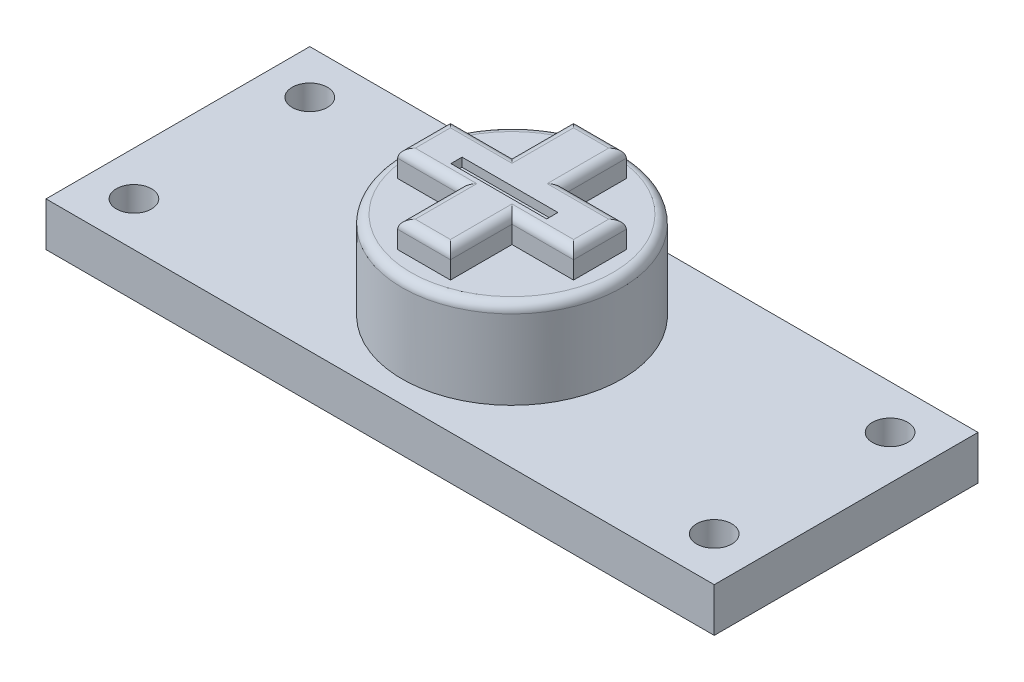
ISO-10303-21;
HEADER;
FILE_DESCRIPTION(('STEP AP214'),'2;1');
FILE_NAME('part.step','',(''),(''),'','','');
FILE_SCHEMA(('AUTOMOTIVE_DESIGN { 1 0 10303 214 1 1 1 1 }'));
ENDSEC;
DATA;
#1=APPLICATION_CONTEXT('core data for automotive mechanical design processes');
#2=APPLICATION_PROTOCOL_DEFINITION('international standard','automotive_design',2000,#1);
#3=PRODUCT_CONTEXT('',#1,'mechanical');
#4=PRODUCT('Part','Part','',(#3));
#5=PRODUCT_RELATED_PRODUCT_CATEGORY('part','',(#4));
#6=PRODUCT_DEFINITION_FORMATION('','',#4);
#7=PRODUCT_DEFINITION_CONTEXT('part definition',#1,'design');
#8=PRODUCT_DEFINITION('design','',#6,#7);
#9=PRODUCT_DEFINITION_SHAPE('','',#8);
#10=(LENGTH_UNIT() NAMED_UNIT(*) SI_UNIT(.MILLI.,.METRE.));
#11=(NAMED_UNIT(*) PLANE_ANGLE_UNIT() SI_UNIT($,.RADIAN.));
#12=(NAMED_UNIT(*) SI_UNIT($,.STERADIAN.) SOLID_ANGLE_UNIT());
#13=UNCERTAINTY_MEASURE_WITH_UNIT(LENGTH_MEASURE(1.E-05),#10,'distance_accuracy_value','');
#14=(GEOMETRIC_REPRESENTATION_CONTEXT(3) GLOBAL_UNCERTAINTY_ASSIGNED_CONTEXT((#13)) GLOBAL_UNIT_ASSIGNED_CONTEXT((#10,
#11,#12)) REPRESENTATION_CONTEXT('',''));
#15=CARTESIAN_POINT('',(0.,0.,0.));
#16=DIRECTION('',(0.,0.,1.));
#17=DIRECTION('',(1.,0.,0.));
#18=AXIS2_PLACEMENT_3D('',#15,#16,#17);
#19=CARTESIAN_POINT('',(-3800.,500.,-1500.));
#20=DIRECTION('',(0.,0.,-1.));
#21=DIRECTION('',(-1.,0.,0.));
#22=AXIS2_PLACEMENT_3D('',#19,#20,#21);
#23=PLANE('',#22);
#24=DIRECTION('',(1.,0.,0.));
#25=VECTOR('',#24,1.);
#26=CARTESIAN_POINT('',(-3800.,0.,-1500.));
#27=LINE('',#26,#25);
#28=CARTESIAN_POINT('',(-3800.,0.,-1500.));
#29=VERTEX_POINT('',#28);
#30=CARTESIAN_POINT('',(3800.,0.,-1500.));
#31=VERTEX_POINT('',#30);
#32=EDGE_CURVE('E384',#29,#31,#27,.T.);
#33=ORIENTED_EDGE('',*,*,#32,.F.);
#34=DIRECTION('',(0.,-1.,0.));
#35=VECTOR('',#34,1.);
#36=CARTESIAN_POINT('',(-3800.,500.,-1500.));
#37=LINE('',#36,#35);
#38=CARTESIAN_POINT('',(-3800.,500.,-1500.));
#39=VERTEX_POINT('',#38);
#40=EDGE_CURVE('E399',#39,#29,#37,.T.);
#41=ORIENTED_EDGE('',*,*,#40,.F.);
#42=DIRECTION('',(1.,0.,0.));
#43=VECTOR('',#42,1.);
#44=CARTESIAN_POINT('',(-3800.,500.,-1500.));
#45=LINE('',#44,#43);
#46=CARTESIAN_POINT('',(3800.,500.,-1500.));
#47=VERTEX_POINT('',#46);
#48=EDGE_CURVE('E368',#39,#47,#45,.T.);
#49=ORIENTED_EDGE('',*,*,#48,.T.);
#50=DIRECTION('',(0.,-1.,0.));
#51=VECTOR('',#50,1.);
#52=CARTESIAN_POINT('',(3800.,500.,-1500.));
#53=LINE('',#52,#51);
#54=EDGE_CURVE('E383',#47,#31,#53,.T.);
#55=ORIENTED_EDGE('',*,*,#54,.T.);
#56=EDGE_LOOP('',(#33,#41,#49,#55));
#57=FACE_BOUND('',#56,.T.);
#58=ADVANCED_FACE('F40',(#57),#23,.T.);
#59=CARTESIAN_POINT('',(-3800.,500.,-1500.));
#60=DIRECTION('',(1.,0.,0.));
#61=DIRECTION('',(0.,0.,-1.));
#62=AXIS2_PLACEMENT_3D('',#59,#60,#61);
#63=PLANE('',#62);
#64=DIRECTION('',(0.,0.,1.));
#65=VECTOR('',#64,1.);
#66=CARTESIAN_POINT('',(-3800.,0.,-1500.));
#67=LINE('',#66,#65);
#68=CARTESIAN_POINT('',(-3800.,0.,1500.));
#69=VERTEX_POINT('',#68);
#70=EDGE_CURVE('E373',#29,#69,#67,.T.);
#71=ORIENTED_EDGE('',*,*,#70,.T.);
#72=DIRECTION('',(0.,-1.,0.));
#73=VECTOR('',#72,1.);
#74=CARTESIAN_POINT('',(-3800.,500.,1500.));
#75=LINE('',#74,#73);
#76=CARTESIAN_POINT('',(-3800.,500.,1500.));
#77=VERTEX_POINT('',#76);
#78=EDGE_CURVE('E403',#77,#69,#75,.T.);
#79=ORIENTED_EDGE('',*,*,#78,.F.);
#80=DIRECTION('',(0.,0.,1.));
#81=VECTOR('',#80,1.);
#82=CARTESIAN_POINT('',(-3800.,500.,-1500.));
#83=LINE('',#82,#81);
#84=EDGE_CURVE('E380',#39,#77,#83,.T.);
#85=ORIENTED_EDGE('',*,*,#84,.F.);
#86=ORIENTED_EDGE('',*,*,#40,.T.);
#87=EDGE_LOOP('',(#71,#79,#85,#86));
#88=FACE_BOUND('',#87,.T.);
#89=ADVANCED_FACE('F566',(#88),#63,.F.);
#90=CARTESIAN_POINT('',(-3800.,500.,1500.));
#91=DIRECTION('',(0.,0.,-1.));
#92=DIRECTION('',(-1.,0.,0.));
#93=AXIS2_PLACEMENT_3D('',#90,#91,#92);
#94=PLANE('',#93);
#95=DIRECTION('',(1.,0.,0.));
#96=VECTOR('',#95,1.);
#97=CARTESIAN_POINT('',(-3800.,0.,1500.));
#98=LINE('',#97,#96);
#99=CARTESIAN_POINT('',(3800.,0.,1500.));
#100=VERTEX_POINT('',#99);
#101=EDGE_CURVE('E393',#69,#100,#98,.T.);
#102=ORIENTED_EDGE('',*,*,#101,.T.);
#103=DIRECTION('',(0.,-1.,0.));
#104=VECTOR('',#103,1.);
#105=CARTESIAN_POINT('',(3800.,500.,1500.));
#106=LINE('',#105,#104);
#107=CARTESIAN_POINT('',(3800.,500.,1500.));
#108=VERTEX_POINT('',#107);
#109=EDGE_CURVE('E407',#108,#100,#106,.T.);
#110=ORIENTED_EDGE('',*,*,#109,.F.);
#111=DIRECTION('',(1.,0.,0.));
#112=VECTOR('',#111,1.);
#113=CARTESIAN_POINT('',(-3800.,500.,1500.));
#114=LINE('',#113,#112);
#115=EDGE_CURVE('E377',#77,#108,#114,.T.);
#116=ORIENTED_EDGE('',*,*,#115,.F.);
#117=ORIENTED_EDGE('',*,*,#78,.T.);
#118=EDGE_LOOP('',(#102,#110,#116,#117));
#119=FACE_BOUND('',#118,.T.);
#120=ADVANCED_FACE('F572',(#119),#94,.F.);
#121=CARTESIAN_POINT('',(3800.,500.,-1500.));
#122=DIRECTION('',(1.,0.,0.));
#123=DIRECTION('',(0.,0.,-1.));
#124=AXIS2_PLACEMENT_3D('',#121,#122,#123);
#125=PLANE('',#124);
#126=DIRECTION('',(0.,0.,1.));
#127=VECTOR('',#126,1.);
#128=CARTESIAN_POINT('',(3800.,0.,-1500.));
#129=LINE('',#128,#127);
#130=EDGE_CURVE('E388',#31,#100,#129,.T.);
#131=ORIENTED_EDGE('',*,*,#130,.F.);
#132=ORIENTED_EDGE('',*,*,#54,.F.);
#133=DIRECTION('',(0.,0.,1.));
#134=VECTOR('',#133,1.);
#135=CARTESIAN_POINT('',(3800.,500.,-1500.));
#136=LINE('',#135,#134);
#137=EDGE_CURVE('E372',#47,#108,#136,.T.);
#138=ORIENTED_EDGE('',*,*,#137,.T.);
#139=ORIENTED_EDGE('',*,*,#109,.T.);
#140=EDGE_LOOP('',(#131,#132,#138,#139));
#141=FACE_BOUND('',#140,.T.);
#142=ADVANCED_FACE('F577',(#141),#125,.T.);
#143=CARTESIAN_POINT('',(0.,500.,0.));
#144=DIRECTION('',(0.,-1.,0.));
#145=DIRECTION('',(0.,0.,-1.));
#146=AXIS2_PLACEMENT_3D('',#143,#144,#145);
#147=PLANE('',#146);
#148=CARTESIAN_POINT('',(0.,500.,0.));
#149=DIRECTION('',(0.,-1.,0.));
#150=DIRECTION('',(0.,0.,-1.));
#151=AXIS2_PLACEMENT_3D('',#148,#149,#150);
#152=CIRCLE('',#151,1250.);
#153=CARTESIAN_POINT('',(0.,500.,-1250.));
#154=VERTEX_POINT('',#153);
#155=EDGE_CURVE('E402',#154,#154,#152,.F.);
#156=ORIENTED_EDGE('',*,*,#155,.F.);
#157=EDGE_LOOP('',(#156));
#158=FACE_BOUND('',#157,.T.);
#159=CARTESIAN_POINT('',(3300.,500.,1000.));
#160=DIRECTION('',(0.,1.,0.));
#161=DIRECTION('',(0.,0.,1.));
#162=AXIS2_PLACEMENT_3D('',#159,#160,#161);
#163=CIRCLE('',#162,200.);
#164=CARTESIAN_POINT('',(3300.,500.,1200.));
#165=VERTEX_POINT('',#164);
#166=EDGE_CURVE('E351',#165,#165,#163,.T.);
#167=ORIENTED_EDGE('',*,*,#166,.F.);
#168=EDGE_LOOP('',(#167));
#169=FACE_BOUND('',#168,.T.);
#170=CARTESIAN_POINT('',(3300.,500.,-1000.));
#171=DIRECTION('',(0.,1.,0.));
#172=DIRECTION('',(0.,0.,1.));
#173=AXIS2_PLACEMENT_3D('',#170,#171,#172);
#174=CIRCLE('',#173,200.);
#175=CARTESIAN_POINT('',(3300.,500.,-800.));
#176=VERTEX_POINT('',#175);
#177=EDGE_CURVE('E357',#176,#176,#174,.T.);
#178=ORIENTED_EDGE('',*,*,#177,.F.);
#179=EDGE_LOOP('',(#178));
#180=FACE_BOUND('',#179,.T.);
#181=CARTESIAN_POINT('',(-3300.,500.,-1000.));
#182=DIRECTION('',(0.,1.,0.));
#183=DIRECTION('',(0.,0.,1.));
#184=AXIS2_PLACEMENT_3D('',#181,#182,#183);
#185=CIRCLE('',#184,200.);
#186=CARTESIAN_POINT('',(-3300.,500.,-800.));
#187=VERTEX_POINT('',#186);
#188=EDGE_CURVE('E352',#187,#187,#185,.T.);
#189=ORIENTED_EDGE('',*,*,#188,.F.);
#190=EDGE_LOOP('',(#189));
#191=FACE_BOUND('',#190,.T.);
#192=CARTESIAN_POINT('',(-3300.,500.,1000.));
#193=DIRECTION('',(0.,1.,0.));
#194=DIRECTION('',(0.,0.,1.));
#195=AXIS2_PLACEMENT_3D('',#192,#193,#194);
#196=CIRCLE('',#195,200.);
#197=CARTESIAN_POINT('',(-3300.,500.,1200.));
#198=VERTEX_POINT('',#197);
#199=EDGE_CURVE('E356',#198,#198,#196,.T.);
#200=ORIENTED_EDGE('',*,*,#199,.F.);
#201=EDGE_LOOP('',(#200));
#202=FACE_BOUND('',#201,.T.);
#203=ORIENTED_EDGE('',*,*,#48,.F.);
#204=ORIENTED_EDGE('',*,*,#84,.T.);
#205=ORIENTED_EDGE('',*,*,#115,.T.);
#206=ORIENTED_EDGE('',*,*,#137,.F.);
#207=EDGE_LOOP('',(#203,#204,#205,#206));
#208=FACE_BOUND('',#207,.T.);
#209=ADVANCED_FACE('F747',(#158,#169,#180,#191,#202,#208),#147,.F.);
#210=CARTESIAN_POINT('',(0.,0.,0.));
#211=DIRECTION('',(0.,-1.,0.));
#212=DIRECTION('',(0.,0.,-1.));
#213=AXIS2_PLACEMENT_3D('',#210,#211,#212);
#214=PLANE('',#213);
#215=CARTESIAN_POINT('',(3300.,0.,1000.));
#216=DIRECTION('',(0.,-1.,0.));
#217=DIRECTION('',(0.,0.,-1.));
#218=AXIS2_PLACEMENT_3D('',#215,#216,#217);
#219=CIRCLE('',#218,200.);
#220=CARTESIAN_POINT('',(3300.,0.,800.));
#221=VERTEX_POINT('',#220);
#222=EDGE_CURVE('E389',#221,#221,#219,.T.);
#223=ORIENTED_EDGE('',*,*,#222,.F.);
#224=EDGE_LOOP('',(#223));
#225=FACE_BOUND('',#224,.T.);
#226=CARTESIAN_POINT('',(3300.,0.,-1000.));
#227=DIRECTION('',(0.,-1.,0.));
#228=DIRECTION('',(0.,0.,-1.));
#229=AXIS2_PLACEMENT_3D('',#226,#227,#228);
#230=CIRCLE('',#229,200.);
#231=CARTESIAN_POINT('',(3300.,0.,-1200.));
#232=VERTEX_POINT('',#231);
#233=EDGE_CURVE('E419',#232,#232,#230,.T.);
#234=ORIENTED_EDGE('',*,*,#233,.F.);
#235=EDGE_LOOP('',(#234));
#236=FACE_BOUND('',#235,.T.);
#237=CARTESIAN_POINT('',(-3300.,0.,-1000.));
#238=DIRECTION('',(0.,-1.,0.));
#239=DIRECTION('',(0.,0.,-1.));
#240=AXIS2_PLACEMENT_3D('',#237,#238,#239);
#241=CIRCLE('',#240,200.);
#242=CARTESIAN_POINT('',(-3300.,0.,-1200.));
#243=VERTEX_POINT('',#242);
#244=EDGE_CURVE('E415',#243,#243,#241,.T.);
#245=ORIENTED_EDGE('',*,*,#244,.F.);
#246=EDGE_LOOP('',(#245));
#247=FACE_BOUND('',#246,.T.);
#248=CARTESIAN_POINT('',(-3300.,0.,1000.));
#249=DIRECTION('',(0.,-1.,0.));
#250=DIRECTION('',(0.,0.,-1.));
#251=AXIS2_PLACEMENT_3D('',#248,#249,#250);
#252=CIRCLE('',#251,200.);
#253=CARTESIAN_POINT('',(-3300.,0.,800.));
#254=VERTEX_POINT('',#253);
#255=EDGE_CURVE('E367',#254,#254,#252,.T.);
#256=ORIENTED_EDGE('',*,*,#255,.F.);
#257=EDGE_LOOP('',(#256));
#258=FACE_BOUND('',#257,.T.);
#259=ORIENTED_EDGE('',*,*,#32,.T.);
#260=ORIENTED_EDGE('',*,*,#130,.T.);
#261=ORIENTED_EDGE('',*,*,#101,.F.);
#262=ORIENTED_EDGE('',*,*,#70,.F.);
#263=EDGE_LOOP('',(#259,#260,#261,#262));
#264=FACE_BOUND('',#263,.T.);
#265=ADVANCED_FACE('F745',(#225,#236,#247,#258,#264),#214,.T.);
#266=CARTESIAN_POINT('',(-3300.,-500.,1000.));
#267=DIRECTION('',(0.,1.,0.));
#268=DIRECTION('',(0.,0.,1.));
#269=AXIS2_PLACEMENT_3D('',#266,#267,#268);
#270=CYLINDRICAL_SURFACE('',#269,200.);
#271=ORIENTED_EDGE('',*,*,#255,.T.);
#272=EDGE_LOOP('',(#271));
#273=FACE_BOUND('',#272,.T.);
#274=ORIENTED_EDGE('',*,*,#199,.T.);
#275=EDGE_LOOP('',(#274));
#276=FACE_BOUND('',#275,.T.);
#277=ADVANCED_FACE('F735',(#273,#276),#270,.F.);
#278=CARTESIAN_POINT('',(-3300.,-500.,-1000.));
#279=DIRECTION('',(0.,1.,0.));
#280=DIRECTION('',(0.,0.,1.));
#281=AXIS2_PLACEMENT_3D('',#278,#279,#280);
#282=CYLINDRICAL_SURFACE('',#281,200.);
#283=ORIENTED_EDGE('',*,*,#244,.T.);
#284=EDGE_LOOP('',(#283));
#285=FACE_BOUND('',#284,.T.);
#286=ORIENTED_EDGE('',*,*,#188,.T.);
#287=EDGE_LOOP('',(#286));
#288=FACE_BOUND('',#287,.T.);
#289=ADVANCED_FACE('F731',(#285,#288),#282,.F.);
#290=CARTESIAN_POINT('',(3300.,-500.,-1000.));
#291=DIRECTION('',(0.,1.,0.));
#292=DIRECTION('',(0.,0.,1.));
#293=AXIS2_PLACEMENT_3D('',#290,#291,#292);
#294=CYLINDRICAL_SURFACE('',#293,200.);
#295=ORIENTED_EDGE('',*,*,#233,.T.);
#296=EDGE_LOOP('',(#295));
#297=FACE_BOUND('',#296,.T.);
#298=ORIENTED_EDGE('',*,*,#177,.T.);
#299=EDGE_LOOP('',(#298));
#300=FACE_BOUND('',#299,.T.);
#301=ADVANCED_FACE('F734',(#297,#300),#294,.F.);
#302=CARTESIAN_POINT('',(3300.,-500.,1000.));
#303=DIRECTION('',(0.,1.,0.));
#304=DIRECTION('',(0.,0.,1.));
#305=AXIS2_PLACEMENT_3D('',#302,#303,#304);
#306=CYLINDRICAL_SURFACE('',#305,200.);
#307=ORIENTED_EDGE('',*,*,#222,.T.);
#308=EDGE_LOOP('',(#307));
#309=FACE_BOUND('',#308,.T.);
#310=ORIENTED_EDGE('',*,*,#166,.T.);
#311=EDGE_LOOP('',(#310));
#312=FACE_BOUND('',#311,.T.);
#313=ADVANCED_FACE('F729',(#309,#312),#306,.F.);
#314=CARTESIAN_POINT('',(0.,1500.,0.));
#315=DIRECTION('',(0.,-1.,0.));
#316=DIRECTION('',(0.,0.,-1.));
#317=AXIS2_PLACEMENT_3D('',#314,#315,#316);
#318=CYLINDRICAL_SURFACE('',#317,1250.);
#319=CARTESIAN_POINT('',(0.,1400.,0.));
#320=DIRECTION('',(0.,1.,0.));
#321=DIRECTION('',(0.,0.,1.));
#322=AXIS2_PLACEMENT_3D('',#319,#320,#321);
#323=CIRCLE('',#322,1250.);
#324=CARTESIAN_POINT('',(0.,1400.,1250.));
#325=VERTEX_POINT('',#324);
#326=EDGE_CURVE('E11',#325,#325,#323,.F.);
#327=ORIENTED_EDGE('',*,*,#326,.T.);
#328=EDGE_LOOP('',(#327));
#329=FACE_BOUND('',#328,.T.);
#330=ORIENTED_EDGE('',*,*,#155,.T.);
#331=EDGE_LOOP('',(#330));
#332=FACE_BOUND('',#331,.T.);
#333=ADVANCED_FACE('F726',(#329,#332),#318,.T.);
#334=CARTESIAN_POINT('',(0.,1500.,0.));
#335=DIRECTION('',(0.,1.,0.));
#336=DIRECTION('',(0.,0.,1.));
#337=AXIS2_PLACEMENT_3D('',#334,#335,#336);
#338=PLANE('',#337);
#339=CARTESIAN_POINT('',(0.,1500.,0.));
#340=DIRECTION('',(0.,1.,0.));
#341=DIRECTION('',(0.,0.,1.));
#342=AXIS2_PLACEMENT_3D('',#339,#340,#341);
#343=CIRCLE('',#342,1150.);
#344=CARTESIAN_POINT('',(0.,1500.,1150.));
#345=VERTEX_POINT('',#344);
#346=EDGE_CURVE('E49',#345,#345,#343,.T.);
#347=ORIENTED_EDGE('',*,*,#346,.T.);
#348=EDGE_LOOP('',(#347));
#349=FACE_BOUND('',#348,.T.);
#350=DIRECTION('',(0.,0.,-1.));
#351=VECTOR('',#350,1.);
#352=CARTESIAN_POINT('',(300.,1500.,300.));
#353=LINE('',#352,#351);
#354=CARTESIAN_POINT('',(300.,1500.,1000.));
#355=VERTEX_POINT('',#354);
#356=CARTESIAN_POINT('',(300.,1500.,300.));
#357=VERTEX_POINT('',#356);
#358=EDGE_CURVE('E266',#355,#357,#353,.T.);
#359=ORIENTED_EDGE('',*,*,#358,.F.);
#360=DIRECTION('',(1.,0.,0.));
#361=VECTOR('',#360,1.);
#362=CARTESIAN_POINT('',(-300.,1500.,1000.));
#363=LINE('',#362,#361);
#364=CARTESIAN_POINT('',(-300.,1500.,1000.));
#365=VERTEX_POINT('',#364);
#366=EDGE_CURVE('E311',#365,#355,#363,.T.);
#367=ORIENTED_EDGE('',*,*,#366,.F.);
#368=DIRECTION('',(0.,0.,1.));
#369=VECTOR('',#368,1.);
#370=CARTESIAN_POINT('',(-300.,1500.,300.));
#371=LINE('',#370,#369);
#372=CARTESIAN_POINT('',(-300.,1500.,300.));
#373=VERTEX_POINT('',#372);
#374=EDGE_CURVE('E307',#373,#365,#371,.T.);
#375=ORIENTED_EDGE('',*,*,#374,.F.);
#376=DIRECTION('',(1.,0.,0.));
#377=VECTOR('',#376,1.);
#378=CARTESIAN_POINT('',(-300.,1500.,300.));
#379=LINE('',#378,#377);
#380=CARTESIAN_POINT('',(-1000.,1500.,300.000000000001));
#381=VERTEX_POINT('',#380);
#382=EDGE_CURVE('E303',#381,#373,#379,.T.);
#383=ORIENTED_EDGE('',*,*,#382,.F.);
#384=DIRECTION('',(0.,0.,1.));
#385=VECTOR('',#384,1.);
#386=CARTESIAN_POINT('',(-1000.,1500.,300.000000000001));
#387=LINE('',#386,#385);
#388=CARTESIAN_POINT('',(-1000.,1500.,-300.));
#389=VERTEX_POINT('',#388);
#390=EDGE_CURVE('E299',#389,#381,#387,.T.);
#391=ORIENTED_EDGE('',*,*,#390,.F.);
#392=DIRECTION('',(-1.,0.,0.));
#393=VECTOR('',#392,1.);
#394=CARTESIAN_POINT('',(-300.,1500.,-300.));
#395=LINE('',#394,#393);
#396=CARTESIAN_POINT('',(-300.,1500.,-300.));
#397=VERTEX_POINT('',#396);
#398=EDGE_CURVE('E295',#397,#389,#395,.T.);
#399=ORIENTED_EDGE('',*,*,#398,.F.);
#400=DIRECTION('',(0.,0.,1.));
#401=VECTOR('',#400,1.);
#402=CARTESIAN_POINT('',(-300.,1500.,-1000.));
#403=LINE('',#402,#401);
#404=CARTESIAN_POINT('',(-300.,1500.,-1000.));
#405=VERTEX_POINT('',#404);
#406=EDGE_CURVE('E291',#405,#397,#403,.T.);
#407=ORIENTED_EDGE('',*,*,#406,.F.);
#408=DIRECTION('',(-1.,0.,0.));
#409=VECTOR('',#408,1.);
#410=CARTESIAN_POINT('',(-300.,1500.,-1000.));
#411=LINE('',#410,#409);
#412=CARTESIAN_POINT('',(300.,1500.,-1000.));
#413=VERTEX_POINT('',#412);
#414=EDGE_CURVE('E287',#413,#405,#411,.T.);
#415=ORIENTED_EDGE('',*,*,#414,.F.);
#416=DIRECTION('',(0.,0.,-1.));
#417=VECTOR('',#416,1.);
#418=CARTESIAN_POINT('',(300.,1500.,-1000.));
#419=LINE('',#418,#417);
#420=CARTESIAN_POINT('',(300.,1500.,-300.));
#421=VERTEX_POINT('',#420);
#422=EDGE_CURVE('E283',#421,#413,#419,.T.);
#423=ORIENTED_EDGE('',*,*,#422,.F.);
#424=DIRECTION('',(-1.,0.,0.));
#425=VECTOR('',#424,1.);
#426=CARTESIAN_POINT('',(1000.,1500.,-300.));
#427=LINE('',#426,#425);
#428=CARTESIAN_POINT('',(1000.,1500.,-300.));
#429=VERTEX_POINT('',#428);
#430=EDGE_CURVE('E279',#429,#421,#427,.T.);
#431=ORIENTED_EDGE('',*,*,#430,.F.);
#432=DIRECTION('',(0.,0.,-1.));
#433=VECTOR('',#432,1.);
#434=CARTESIAN_POINT('',(1000.,1500.,300.));
#435=LINE('',#434,#433);
#436=CARTESIAN_POINT('',(1000.,1500.,300.));
#437=VERTEX_POINT('',#436);
#438=EDGE_CURVE('E275',#437,#429,#435,.T.);
#439=ORIENTED_EDGE('',*,*,#438,.F.);
#440=DIRECTION('',(1.,0.,0.));
#441=VECTOR('',#440,1.);
#442=CARTESIAN_POINT('',(1000.,1500.,300.));
#443=LINE('',#442,#441);
#444=EDGE_CURVE('E270',#357,#437,#443,.T.);
#445=ORIENTED_EDGE('',*,*,#444,.F.);
#446=EDGE_LOOP('',(#359,#367,#375,#383,#391,#399,#407,#415,#423,#431,#439,#445));
#447=FACE_BOUND('',#446,.T.);
#448=ADVANCED_FACE('F549',(#349,#447),#338,.T.);
#449=CARTESIAN_POINT('',(300.,1800.,300.));
#450=DIRECTION('',(-1.,0.,0.));
#451=DIRECTION('',(0.,0.,1.));
#452=AXIS2_PLACEMENT_3D('',#449,#450,#451);
#453=PLANE('',#452);
#454=DIRECTION('',(0.,-1.,0.));
#455=VECTOR('',#454,1.);
#456=CARTESIAN_POINT('',(300.,1800.,300.));
#457=LINE('',#456,#455);
#458=CARTESIAN_POINT('',(300.,1700.,300.));
#459=VERTEX_POINT('',#458);
#460=EDGE_CURVE('E348',#459,#357,#457,.T.);
#461=ORIENTED_EDGE('',*,*,#460,.F.);
#462=DIRECTION('',(0.,0.,-1.));
#463=VECTOR('',#462,1.);
#464=CARTESIAN_POINT('',(300.,1700.,1000.));
#465=LINE('',#464,#463);
#466=CARTESIAN_POINT('',(300.,1700.,1000.));
#467=VERTEX_POINT('',#466);
#468=EDGE_CURVE('E499',#459,#467,#465,.F.);
#469=ORIENTED_EDGE('',*,*,#468,.T.);
#470=DIRECTION('',(0.,-1.,0.));
#471=VECTOR('',#470,1.);
#472=CARTESIAN_POINT('',(300.,1800.,1000.));
#473=LINE('',#472,#471);
#474=EDGE_CURVE('E315',#467,#355,#473,.T.);
#475=ORIENTED_EDGE('',*,*,#474,.T.);
#476=ORIENTED_EDGE('',*,*,#358,.T.);
#477=EDGE_LOOP('',(#461,#469,#475,#476));
#478=FACE_BOUND('',#477,.T.);
#479=ADVANCED_FACE('F663',(#478),#453,.F.);
#480=CARTESIAN_POINT('',(1000.,1800.,300.));
#481=DIRECTION('',(0.,0.,-1.));
#482=DIRECTION('',(-1.,0.,0.));
#483=AXIS2_PLACEMENT_3D('',#480,#481,#482);
#484=PLANE('',#483);
#485=DIRECTION('',(0.,-1.,0.));
#486=VECTOR('',#485,1.);
#487=CARTESIAN_POINT('',(1000.,1800.,300.));
#488=LINE('',#487,#486);
#489=CARTESIAN_POINT('',(1000.,1700.,300.));
#490=VERTEX_POINT('',#489);
#491=EDGE_CURVE('E345',#490,#437,#488,.T.);
#492=ORIENTED_EDGE('',*,*,#491,.F.);
#493=DIRECTION('',(1.,0.,0.));
#494=VECTOR('',#493,1.);
#495=CARTESIAN_POINT('',(300.,1700.,300.));
#496=LINE('',#495,#494);
#497=EDGE_CURVE('E64',#490,#459,#496,.F.);
#498=ORIENTED_EDGE('',*,*,#497,.T.);
#499=ORIENTED_EDGE('',*,*,#460,.T.);
#500=ORIENTED_EDGE('',*,*,#444,.T.);
#501=EDGE_LOOP('',(#492,#498,#499,#500));
#502=FACE_BOUND('',#501,.T.);
#503=ADVANCED_FACE('F654',(#502),#484,.F.);
#504=CARTESIAN_POINT('',(1000.,1800.,300.));
#505=DIRECTION('',(-1.,0.,0.));
#506=DIRECTION('',(0.,0.,1.));
#507=AXIS2_PLACEMENT_3D('',#504,#505,#506);
#508=PLANE('',#507);
#509=DIRECTION('',(0.,-1.,0.));
#510=VECTOR('',#509,1.);
#511=CARTESIAN_POINT('',(1000.,1800.,-300.));
#512=LINE('',#511,#510);
#513=CARTESIAN_POINT('',(1000.,1700.,-300.));
#514=VERTEX_POINT('',#513);
#515=EDGE_CURVE('E342',#514,#429,#512,.T.);
#516=ORIENTED_EDGE('',*,*,#515,.F.);
#517=DIRECTION('',(0.,0.,-1.));
#518=VECTOR('',#517,1.);
#519=CARTESIAN_POINT('',(1000.,1700.,300.));
#520=LINE('',#519,#518);
#521=EDGE_CURVE('E494',#514,#490,#520,.F.);
#522=ORIENTED_EDGE('',*,*,#521,.T.);
#523=ORIENTED_EDGE('',*,*,#491,.T.);
#524=ORIENTED_EDGE('',*,*,#438,.T.);
#525=EDGE_LOOP('',(#516,#522,#523,#524));
#526=FACE_BOUND('',#525,.T.);
#527=ADVANCED_FACE('F650',(#526),#508,.F.);
#528=CARTESIAN_POINT('',(1000.,1800.,-300.));
#529=DIRECTION('',(0.,0.,1.));
#530=DIRECTION('',(1.,0.,0.));
#531=AXIS2_PLACEMENT_3D('',#528,#529,#530);
#532=PLANE('',#531);
#533=DIRECTION('',(0.,-1.,0.));
#534=VECTOR('',#533,1.);
#535=CARTESIAN_POINT('',(300.,1800.,-300.));
#536=LINE('',#535,#534);
#537=CARTESIAN_POINT('',(300.,1700.,-300.));
#538=VERTEX_POINT('',#537);
#539=EDGE_CURVE('E339',#538,#421,#536,.T.);
#540=ORIENTED_EDGE('',*,*,#539,.F.);
#541=DIRECTION('',(-1.,0.,0.));
#542=VECTOR('',#541,1.);
#543=CARTESIAN_POINT('',(1000.,1700.,-300.));
#544=LINE('',#543,#542);
#545=EDGE_CURVE('E491',#538,#514,#544,.F.);
#546=ORIENTED_EDGE('',*,*,#545,.T.);
#547=ORIENTED_EDGE('',*,*,#515,.T.);
#548=ORIENTED_EDGE('',*,*,#430,.T.);
#549=EDGE_LOOP('',(#540,#546,#547,#548));
#550=FACE_BOUND('',#549,.T.);
#551=ADVANCED_FACE('F642',(#550),#532,.F.);
#552=CARTESIAN_POINT('',(300.,1800.,-1000.));
#553=DIRECTION('',(-1.,0.,0.));
#554=DIRECTION('',(0.,0.,1.));
#555=AXIS2_PLACEMENT_3D('',#552,#553,#554);
#556=PLANE('',#555);
#557=DIRECTION('',(0.,-1.,0.));
#558=VECTOR('',#557,1.);
#559=CARTESIAN_POINT('',(300.,1800.,-1000.));
#560=LINE('',#559,#558);
#561=CARTESIAN_POINT('',(300.,1700.,-1000.));
#562=VERTEX_POINT('',#561);
#563=EDGE_CURVE('E336',#562,#413,#560,.T.);
#564=ORIENTED_EDGE('',*,*,#563,.F.);
#565=DIRECTION('',(0.,0.,-1.));
#566=VECTOR('',#565,1.);
#567=CARTESIAN_POINT('',(300.,1700.,-300.));
#568=LINE('',#567,#566);
#569=EDGE_CURVE('E488',#562,#538,#568,.F.);
#570=ORIENTED_EDGE('',*,*,#569,.T.);
#571=ORIENTED_EDGE('',*,*,#539,.T.);
#572=ORIENTED_EDGE('',*,*,#422,.T.);
#573=EDGE_LOOP('',(#564,#570,#571,#572));
#574=FACE_BOUND('',#573,.T.);
#575=ADVANCED_FACE('F639',(#574),#556,.F.);
#576=CARTESIAN_POINT('',(-300.,1800.,-1000.));
#577=DIRECTION('',(0.,0.,1.));
#578=DIRECTION('',(1.,0.,0.));
#579=AXIS2_PLACEMENT_3D('',#576,#577,#578);
#580=PLANE('',#579);
#581=DIRECTION('',(0.,-1.,0.));
#582=VECTOR('',#581,1.);
#583=CARTESIAN_POINT('',(-300.,1800.,-1000.));
#584=LINE('',#583,#582);
#585=CARTESIAN_POINT('',(-300.,1700.,-1000.));
#586=VERTEX_POINT('',#585);
#587=EDGE_CURVE('E333',#586,#405,#584,.T.);
#588=ORIENTED_EDGE('',*,*,#587,.F.);
#589=DIRECTION('',(-1.,0.,0.));
#590=VECTOR('',#589,1.);
#591=CARTESIAN_POINT('',(300.,1700.,-1000.));
#592=LINE('',#591,#590);
#593=EDGE_CURVE('E485',#586,#562,#592,.F.);
#594=ORIENTED_EDGE('',*,*,#593,.T.);
#595=ORIENTED_EDGE('',*,*,#563,.T.);
#596=ORIENTED_EDGE('',*,*,#414,.T.);
#597=EDGE_LOOP('',(#588,#594,#595,#596));
#598=FACE_BOUND('',#597,.T.);
#599=ADVANCED_FACE('F705',(#598),#580,.F.);
#600=CARTESIAN_POINT('',(-300.,1800.,-1000.));
#601=DIRECTION('',(1.,0.,0.));
#602=DIRECTION('',(0.,0.,-1.));
#603=AXIS2_PLACEMENT_3D('',#600,#601,#602);
#604=PLANE('',#603);
#605=DIRECTION('',(0.,-1.,0.));
#606=VECTOR('',#605,1.);
#607=CARTESIAN_POINT('',(-300.,1800.,-300.));
#608=LINE('',#607,#606);
#609=CARTESIAN_POINT('',(-300.,1700.,-300.));
#610=VERTEX_POINT('',#609);
#611=EDGE_CURVE('E330',#610,#397,#608,.T.);
#612=ORIENTED_EDGE('',*,*,#611,.F.);
#613=DIRECTION('',(0.,0.,1.));
#614=VECTOR('',#613,1.);
#615=CARTESIAN_POINT('',(-300.,1700.,-1000.));
#616=LINE('',#615,#614);
#617=EDGE_CURVE('E482',#610,#586,#616,.F.);
#618=ORIENTED_EDGE('',*,*,#617,.T.);
#619=ORIENTED_EDGE('',*,*,#587,.T.);
#620=ORIENTED_EDGE('',*,*,#406,.T.);
#621=EDGE_LOOP('',(#612,#618,#619,#620));
#622=FACE_BOUND('',#621,.T.);
#623=ADVANCED_FACE('F702',(#622),#604,.F.);
#624=CARTESIAN_POINT('',(-300.,1800.,-300.));
#625=DIRECTION('',(0.,0.,1.));
#626=DIRECTION('',(1.,0.,0.));
#627=AXIS2_PLACEMENT_3D('',#624,#625,#626);
#628=PLANE('',#627);
#629=DIRECTION('',(0.,-1.,0.));
#630=VECTOR('',#629,1.);
#631=CARTESIAN_POINT('',(-1000.,1800.,-300.));
#632=LINE('',#631,#630);
#633=CARTESIAN_POINT('',(-1000.,1700.,-300.));
#634=VERTEX_POINT('',#633);
#635=EDGE_CURVE('E327',#634,#389,#632,.T.);
#636=ORIENTED_EDGE('',*,*,#635,.F.);
#637=DIRECTION('',(-1.,0.,0.));
#638=VECTOR('',#637,1.);
#639=CARTESIAN_POINT('',(-300.,1700.,-300.));
#640=LINE('',#639,#638);
#641=EDGE_CURVE('E479',#634,#610,#640,.F.);
#642=ORIENTED_EDGE('',*,*,#641,.T.);
#643=ORIENTED_EDGE('',*,*,#611,.T.);
#644=ORIENTED_EDGE('',*,*,#398,.T.);
#645=EDGE_LOOP('',(#636,#642,#643,#644));
#646=FACE_BOUND('',#645,.T.);
#647=ADVANCED_FACE('F693',(#646),#628,.F.);
#648=CARTESIAN_POINT('',(-1000.,1800.,300.000000000001));
#649=DIRECTION('',(1.,0.,0.));
#650=DIRECTION('',(0.,0.,-1.));
#651=AXIS2_PLACEMENT_3D('',#648,#649,#650);
#652=PLANE('',#651);
#653=DIRECTION('',(0.,-1.,0.));
#654=VECTOR('',#653,1.);
#655=CARTESIAN_POINT('',(-1000.,1800.,300.000000000001));
#656=LINE('',#655,#654);
#657=CARTESIAN_POINT('',(-1000.,1700.,300.000000000001));
#658=VERTEX_POINT('',#657);
#659=EDGE_CURVE('E324',#658,#381,#656,.T.);
#660=ORIENTED_EDGE('',*,*,#659,.F.);
#661=DIRECTION('',(0.,0.,1.));
#662=VECTOR('',#661,1.);
#663=CARTESIAN_POINT('',(-1000.,1700.,-300.));
#664=LINE('',#663,#662);
#665=EDGE_CURVE('E476',#658,#634,#664,.F.);
#666=ORIENTED_EDGE('',*,*,#665,.T.);
#667=ORIENTED_EDGE('',*,*,#635,.T.);
#668=ORIENTED_EDGE('',*,*,#390,.T.);
#669=EDGE_LOOP('',(#660,#666,#667,#668));
#670=FACE_BOUND('',#669,.T.);
#671=ADVANCED_FACE('F689',(#670),#652,.F.);
#672=CARTESIAN_POINT('',(-300.,1800.,300.));
#673=DIRECTION('',(0.,0.,-1.));
#674=DIRECTION('',(-1.,0.,0.));
#675=AXIS2_PLACEMENT_3D('',#672,#673,#674);
#676=PLANE('',#675);
#677=DIRECTION('',(0.,-1.,0.));
#678=VECTOR('',#677,1.);
#679=CARTESIAN_POINT('',(-300.,1800.,300.));
#680=LINE('',#679,#678);
#681=CARTESIAN_POINT('',(-300.,1700.,300.));
#682=VERTEX_POINT('',#681);
#683=EDGE_CURVE('E321',#682,#373,#680,.T.);
#684=ORIENTED_EDGE('',*,*,#683,.F.);
#685=DIRECTION('',(1.,0.,0.));
#686=VECTOR('',#685,1.);
#687=CARTESIAN_POINT('',(-1000.,1700.,300.000000000001));
#688=LINE('',#687,#686);
#689=EDGE_CURVE('E473',#682,#658,#688,.F.);
#690=ORIENTED_EDGE('',*,*,#689,.T.);
#691=ORIENTED_EDGE('',*,*,#659,.T.);
#692=ORIENTED_EDGE('',*,*,#382,.T.);
#693=EDGE_LOOP('',(#684,#690,#691,#692));
#694=FACE_BOUND('',#693,.T.);
#695=ADVANCED_FACE('F679',(#694),#676,.F.);
#696=CARTESIAN_POINT('',(-300.,1800.,300.));
#697=DIRECTION('',(1.,0.,0.));
#698=DIRECTION('',(0.,0.,-1.));
#699=AXIS2_PLACEMENT_3D('',#696,#697,#698);
#700=PLANE('',#699);
#701=DIRECTION('',(0.,-1.,0.));
#702=VECTOR('',#701,1.);
#703=CARTESIAN_POINT('',(-300.,1800.,1000.));
#704=LINE('',#703,#702);
#705=CARTESIAN_POINT('',(-300.,1700.,1000.));
#706=VERTEX_POINT('',#705);
#707=EDGE_CURVE('E318',#706,#365,#704,.T.);
#708=ORIENTED_EDGE('',*,*,#707,.F.);
#709=DIRECTION('',(0.,0.,1.));
#710=VECTOR('',#709,1.);
#711=CARTESIAN_POINT('',(-300.,1700.,300.));
#712=LINE('',#711,#710);
#713=EDGE_CURVE('E470',#706,#682,#712,.F.);
#714=ORIENTED_EDGE('',*,*,#713,.T.);
#715=ORIENTED_EDGE('',*,*,#683,.T.);
#716=ORIENTED_EDGE('',*,*,#374,.T.);
#717=EDGE_LOOP('',(#708,#714,#715,#716));
#718=FACE_BOUND('',#717,.T.);
#719=ADVANCED_FACE('F675',(#718),#700,.F.);
#720=CARTESIAN_POINT('',(-300.,1800.,1000.));
#721=DIRECTION('',(0.,0.,-1.));
#722=DIRECTION('',(-1.,0.,0.));
#723=AXIS2_PLACEMENT_3D('',#720,#721,#722);
#724=PLANE('',#723);
#725=ORIENTED_EDGE('',*,*,#474,.F.);
#726=DIRECTION('',(1.,0.,0.));
#727=VECTOR('',#726,1.);
#728=CARTESIAN_POINT('',(-300.,1700.,1000.));
#729=LINE('',#728,#727);
#730=EDGE_CURVE('E466',#467,#706,#729,.F.);
#731=ORIENTED_EDGE('',*,*,#730,.T.);
#732=ORIENTED_EDGE('',*,*,#707,.T.);
#733=ORIENTED_EDGE('',*,*,#366,.T.);
#734=EDGE_LOOP('',(#725,#731,#732,#733));
#735=FACE_BOUND('',#734,.T.);
#736=ADVANCED_FACE('F625',(#735),#724,.F.);
#737=CARTESIAN_POINT('',(0.,1800.,0.));
#738=DIRECTION('',(0.,1.,0.));
#739=DIRECTION('',(0.,0.,1.));
#740=AXIS2_PLACEMENT_3D('',#737,#738,#739);
#741=PLANE('',#740);
#742=DIRECTION('',(0.,0.,-1.));
#743=VECTOR('',#742,1.);
#744=CARTESIAN_POINT('',(545.25,1800.,23.0000000000005));
#745=LINE('',#744,#743);
#746=CARTESIAN_POINT('',(545.25,1800.,150.));
#747=VERTEX_POINT('',#746);
#748=CARTESIAN_POINT('',(545.25,1800.,23.0000000000005));
#749=VERTEX_POINT('',#748);
#750=EDGE_CURVE('E56',#747,#749,#745,.T.);
#751=ORIENTED_EDGE('',*,*,#750,.F.);
#752=DIRECTION('',(1.,0.,0.));
#753=VECTOR('',#752,1.);
#754=CARTESIAN_POINT('',(-545.25,1800.,150.));
#755=LINE('',#754,#753);
#756=CARTESIAN_POINT('',(-545.25,1800.,150.));
#757=VERTEX_POINT('',#756);
#758=EDGE_CURVE('E238',#757,#747,#755,.T.);
#759=ORIENTED_EDGE('',*,*,#758,.F.);
#760=DIRECTION('',(0.,0.,1.));
#761=VECTOR('',#760,1.);
#762=CARTESIAN_POINT('',(-545.25,1800.,23.0000000000005));
#763=LINE('',#762,#761);
#764=CARTESIAN_POINT('',(-545.25,1800.,23.0000000000005));
#765=VERTEX_POINT('',#764);
#766=EDGE_CURVE('E242',#765,#757,#763,.T.);
#767=ORIENTED_EDGE('',*,*,#766,.F.);
#768=DIRECTION('',(-1.,0.,0.));
#769=VECTOR('',#768,1.);
#770=CARTESIAN_POINT('',(-545.25,1800.,23.0000000000005));
#771=LINE('',#770,#769);
#772=EDGE_CURVE('E251',#749,#765,#771,.T.);
#773=ORIENTED_EDGE('',*,*,#772,.F.);
#774=EDGE_LOOP('',(#751,#759,#767,#773));
#775=FACE_BOUND('',#774,.T.);
#776=DIRECTION('',(0.,0.,1.));
#777=VECTOR('',#776,1.);
#778=CARTESIAN_POINT('',(-200.,1800.,1000.));
#779=LINE('',#778,#777);
#780=CARTESIAN_POINT('',(-200.,1800.,200.));
#781=VERTEX_POINT('',#780);
#782=CARTESIAN_POINT('',(-200.,1800.,900.));
#783=VERTEX_POINT('',#782);
#784=EDGE_CURVE('E459',#781,#783,#779,.T.);
#785=ORIENTED_EDGE('',*,*,#784,.T.);
#786=DIRECTION('',(1.,0.,0.));
#787=VECTOR('',#786,1.);
#788=CARTESIAN_POINT('',(300.,1800.,900.));
#789=LINE('',#788,#787);
#790=CARTESIAN_POINT('',(200.,1800.,900.));
#791=VERTEX_POINT('',#790);
#792=EDGE_CURVE('E462',#783,#791,#789,.T.);
#793=ORIENTED_EDGE('',*,*,#792,.T.);
#794=DIRECTION('',(0.,0.,-1.));
#795=VECTOR('',#794,1.);
#796=CARTESIAN_POINT('',(200.,1800.,300.));
#797=LINE('',#796,#795);
#798=CARTESIAN_POINT('',(200.,1800.,200.));
#799=VERTEX_POINT('',#798);
#800=EDGE_CURVE('E429',#791,#799,#797,.T.);
#801=ORIENTED_EDGE('',*,*,#800,.T.);
#802=DIRECTION('',(1.,0.,0.));
#803=VECTOR('',#802,1.);
#804=CARTESIAN_POINT('',(1000.,1800.,200.));
#805=LINE('',#804,#803);
#806=CARTESIAN_POINT('',(900.,1800.,200.));
#807=VERTEX_POINT('',#806);
#808=EDGE_CURVE('E432',#799,#807,#805,.T.);
#809=ORIENTED_EDGE('',*,*,#808,.T.);
#810=DIRECTION('',(0.,0.,-1.));
#811=VECTOR('',#810,1.);
#812=CARTESIAN_POINT('',(900.,1800.,-300.));
#813=LINE('',#812,#811);
#814=CARTESIAN_POINT('',(900.,1800.,-200.));
#815=VERTEX_POINT('',#814);
#816=EDGE_CURVE('E435',#807,#815,#813,.T.);
#817=ORIENTED_EDGE('',*,*,#816,.T.);
#818=DIRECTION('',(-1.,0.,0.));
#819=VECTOR('',#818,1.);
#820=CARTESIAN_POINT('',(300.,1800.,-200.));
#821=LINE('',#820,#819);
#822=CARTESIAN_POINT('',(200.,1800.,-200.));
#823=VERTEX_POINT('',#822);
#824=EDGE_CURVE('E438',#815,#823,#821,.T.);
#825=ORIENTED_EDGE('',*,*,#824,.T.);
#826=DIRECTION('',(0.,0.,-1.));
#827=VECTOR('',#826,1.);
#828=CARTESIAN_POINT('',(200.,1800.,-1000.));
#829=LINE('',#828,#827);
#830=CARTESIAN_POINT('',(200.,1800.,-900.));
#831=VERTEX_POINT('',#830);
#832=EDGE_CURVE('E441',#823,#831,#829,.T.);
#833=ORIENTED_EDGE('',*,*,#832,.T.);
#834=DIRECTION('',(-1.,0.,0.));
#835=VECTOR('',#834,1.);
#836=CARTESIAN_POINT('',(-300.,1800.,-900.));
#837=LINE('',#836,#835);
#838=CARTESIAN_POINT('',(-200.,1800.,-900.));
#839=VERTEX_POINT('',#838);
#840=EDGE_CURVE('E444',#831,#839,#837,.T.);
#841=ORIENTED_EDGE('',*,*,#840,.T.);
#842=DIRECTION('',(0.,0.,1.));
#843=VECTOR('',#842,1.);
#844=CARTESIAN_POINT('',(-200.,1800.,-300.));
#845=LINE('',#844,#843);
#846=CARTESIAN_POINT('',(-200.,1800.,-200.));
#847=VERTEX_POINT('',#846);
#848=EDGE_CURVE('E447',#839,#847,#845,.T.);
#849=ORIENTED_EDGE('',*,*,#848,.T.);
#850=DIRECTION('',(-1.,0.,0.));
#851=VECTOR('',#850,1.);
#852=CARTESIAN_POINT('',(-1000.,1800.,-200.));
#853=LINE('',#852,#851);
#854=CARTESIAN_POINT('',(-900.,1800.,-200.));
#855=VERTEX_POINT('',#854);
#856=EDGE_CURVE('E450',#847,#855,#853,.T.);
#857=ORIENTED_EDGE('',*,*,#856,.T.);
#858=DIRECTION('',(0.,0.,1.));
#859=VECTOR('',#858,1.);
#860=CARTESIAN_POINT('',(-900.,1800.,300.000000000001));
#861=LINE('',#860,#859);
#862=CARTESIAN_POINT('',(-900.,1800.,200.));
#863=VERTEX_POINT('',#862);
#864=EDGE_CURVE('E453',#855,#863,#861,.T.);
#865=ORIENTED_EDGE('',*,*,#864,.T.);
#866=DIRECTION('',(1.,0.,0.));
#867=VECTOR('',#866,1.);
#868=CARTESIAN_POINT('',(-300.,1800.,200.));
#869=LINE('',#868,#867);
#870=EDGE_CURVE('E456',#863,#781,#869,.T.);
#871=ORIENTED_EDGE('',*,*,#870,.T.);
#872=EDGE_LOOP('',(#785,#793,#801,#809,#817,#825,#833,#841,#849,#857,#865,#871));
#873=FACE_BOUND('',#872,.T.);
#874=ADVANCED_FACE('F620',(#775,#873),#741,.T.);
#875=CARTESIAN_POINT('',(0.,1700.,-900.));
#876=DIRECTION('',(1.,0.,0.));
#877=DIRECTION('',(0.,0.,-1.));
#878=AXIS2_PLACEMENT_3D('',#875,#876,#877);
#879=CYLINDRICAL_SURFACE('',#878,100.);
#880=CARTESIAN_POINT('',(200.,1700.,-900.));
#881=DIRECTION('',(0.707106781186547,0.,0.707106781186547));
#882=DIRECTION('',(-0.707106781186547,0.,0.707106781186548));
#883=AXIS2_PLACEMENT_3D('',#880,#881,#882);
#884=ELLIPSE('',#883,141.42135623731,100.);
#885=EDGE_CURVE('E539',#562,#831,#884,.T.);
#886=ORIENTED_EDGE('',*,*,#885,.F.);
#887=ORIENTED_EDGE('',*,*,#593,.F.);
#888=CARTESIAN_POINT('',(-200.,1700.,-900.));
#889=DIRECTION('',(0.707106781186547,0.,-0.707106781186547));
#890=DIRECTION('',(0.707106781186547,0.,0.707106781186548));
#891=AXIS2_PLACEMENT_3D('',#888,#889,#890);
#892=ELLIPSE('',#891,141.42135623731,100.);
#893=EDGE_CURVE('E271',#839,#586,#892,.F.);
#894=ORIENTED_EDGE('',*,*,#893,.F.);
#895=ORIENTED_EDGE('',*,*,#840,.F.);
#896=EDGE_LOOP('',(#886,#887,#894,#895));
#897=FACE_BOUND('',#896,.T.);
#898=ADVANCED_FACE('F617',(#897),#879,.T.);
#899=CARTESIAN_POINT('',(-200.,1700.,0.));
#900=DIRECTION('',(0.,0.,-1.));
#901=DIRECTION('',(-1.,0.,0.));
#902=AXIS2_PLACEMENT_3D('',#899,#900,#901);
#903=CYLINDRICAL_SURFACE('',#902,100.);
#904=ORIENTED_EDGE('',*,*,#893,.T.);
#905=ORIENTED_EDGE('',*,*,#617,.F.);
#906=CARTESIAN_POINT('',(-200.,1700.,-200.));
#907=DIRECTION('',(0.707106781186547,0.,-0.707106781186548));
#908=DIRECTION('',(0.707106781186547,0.,0.707106781186547));
#909=AXIS2_PLACEMENT_3D('',#906,#907,#908);
#910=ELLIPSE('',#909,141.42135623731,100.);
#911=EDGE_CURVE('E535',#847,#610,#910,.F.);
#912=ORIENTED_EDGE('',*,*,#911,.F.);
#913=ORIENTED_EDGE('',*,*,#848,.F.);
#914=EDGE_LOOP('',(#904,#905,#912,#913));
#915=FACE_BOUND('',#914,.T.);
#916=ADVANCED_FACE('F614',(#915),#903,.T.);
#917=CARTESIAN_POINT('',(200.,1700.,0.));
#918=DIRECTION('',(0.,0.,1.));
#919=DIRECTION('',(1.,0.,0.));
#920=AXIS2_PLACEMENT_3D('',#917,#918,#919);
#921=CYLINDRICAL_SURFACE('',#920,100.);
#922=ORIENTED_EDGE('',*,*,#885,.T.);
#923=ORIENTED_EDGE('',*,*,#832,.F.);
#924=CARTESIAN_POINT('',(200.,1700.,-200.));
#925=DIRECTION('',(0.707106781186548,0.,0.707106781186547));
#926=DIRECTION('',(-0.707106781186547,0.,0.707106781186548));
#927=AXIS2_PLACEMENT_3D('',#924,#925,#926);
#928=ELLIPSE('',#927,141.42135623731,100.);
#929=EDGE_CURVE('E531',#538,#823,#928,.T.);
#930=ORIENTED_EDGE('',*,*,#929,.F.);
#931=ORIENTED_EDGE('',*,*,#569,.F.);
#932=EDGE_LOOP('',(#922,#923,#930,#931));
#933=FACE_BOUND('',#932,.T.);
#934=ADVANCED_FACE('F610',(#933),#921,.T.);
#935=CARTESIAN_POINT('',(0.,1700.,-200.));
#936=DIRECTION('',(1.,0.,0.));
#937=DIRECTION('',(0.,0.,-1.));
#938=AXIS2_PLACEMENT_3D('',#935,#936,#937);
#939=CYLINDRICAL_SURFACE('',#938,100.);
#940=ORIENTED_EDGE('',*,*,#911,.T.);
#941=ORIENTED_EDGE('',*,*,#641,.F.);
#942=CARTESIAN_POINT('',(-900.,1700.,-200.));
#943=DIRECTION('',(0.707106781186547,0.,-0.707106781186548));
#944=DIRECTION('',(0.707106781186548,0.,0.707106781186547));
#945=AXIS2_PLACEMENT_3D('',#942,#943,#944);
#946=ELLIPSE('',#945,141.42135623731,100.);
#947=EDGE_CURVE('E527',#855,#634,#946,.F.);
#948=ORIENTED_EDGE('',*,*,#947,.F.);
#949=ORIENTED_EDGE('',*,*,#856,.F.);
#950=EDGE_LOOP('',(#940,#941,#948,#949));
#951=FACE_BOUND('',#950,.T.);
#952=ADVANCED_FACE('F606',(#951),#939,.T.);
#953=CARTESIAN_POINT('',(0.,1700.,-200.));
#954=DIRECTION('',(1.,0.,0.));
#955=DIRECTION('',(0.,0.,-1.));
#956=AXIS2_PLACEMENT_3D('',#953,#954,#955);
#957=CYLINDRICAL_SURFACE('',#956,100.);
#958=ORIENTED_EDGE('',*,*,#929,.T.);
#959=ORIENTED_EDGE('',*,*,#824,.F.);
#960=CARTESIAN_POINT('',(900.,1700.,-200.));
#961=DIRECTION('',(0.707106781186548,0.,0.707106781186547));
#962=DIRECTION('',(-0.707106781186547,0.,0.707106781186547));
#963=AXIS2_PLACEMENT_3D('',#960,#961,#962);
#964=ELLIPSE('',#963,141.42135623731,100.);
#965=EDGE_CURVE('E523',#514,#815,#964,.T.);
#966=ORIENTED_EDGE('',*,*,#965,.F.);
#967=ORIENTED_EDGE('',*,*,#545,.F.);
#968=EDGE_LOOP('',(#958,#959,#966,#967));
#969=FACE_BOUND('',#968,.T.);
#970=ADVANCED_FACE('F602',(#969),#957,.T.);
#971=CARTESIAN_POINT('',(-900.,1700.,0.));
#972=DIRECTION('',(0.,0.,-1.));
#973=DIRECTION('',(-1.,0.,0.));
#974=AXIS2_PLACEMENT_3D('',#971,#972,#973);
#975=CYLINDRICAL_SURFACE('',#974,100.);
#976=ORIENTED_EDGE('',*,*,#947,.T.);
#977=ORIENTED_EDGE('',*,*,#665,.F.);
#978=CARTESIAN_POINT('',(-900.,1700.,200.));
#979=DIRECTION('',(-0.707106781186548,0.,-0.707106781186547));
#980=DIRECTION('',(0.707106781186547,0.,-0.707106781186548));
#981=AXIS2_PLACEMENT_3D('',#978,#979,#980);
#982=ELLIPSE('',#981,141.42135623731,100.);
#983=EDGE_CURVE('E519',#863,#658,#982,.F.);
#984=ORIENTED_EDGE('',*,*,#983,.F.);
#985=ORIENTED_EDGE('',*,*,#864,.F.);
#986=EDGE_LOOP('',(#976,#977,#984,#985));
#987=FACE_BOUND('',#986,.T.);
#988=ADVANCED_FACE('F598',(#987),#975,.T.);
#989=CARTESIAN_POINT('',(900.,1700.,0.));
#990=DIRECTION('',(0.,0.,1.));
#991=DIRECTION('',(1.,0.,0.));
#992=AXIS2_PLACEMENT_3D('',#989,#990,#991);
#993=CYLINDRICAL_SURFACE('',#992,100.);
#994=ORIENTED_EDGE('',*,*,#965,.T.);
#995=ORIENTED_EDGE('',*,*,#816,.F.);
#996=CARTESIAN_POINT('',(900.,1700.,200.));
#997=DIRECTION('',(-0.707106781186547,0.,0.707106781186548));
#998=DIRECTION('',(-0.707106781186548,0.,-0.707106781186547));
#999=AXIS2_PLACEMENT_3D('',#996,#997,#998);
#1000=ELLIPSE('',#999,141.42135623731,100.);
#1001=EDGE_CURVE('E515',#490,#807,#1000,.T.);
#1002=ORIENTED_EDGE('',*,*,#1001,.F.);
#1003=ORIENTED_EDGE('',*,*,#521,.F.);
#1004=EDGE_LOOP('',(#994,#995,#1002,#1003));
#1005=FACE_BOUND('',#1004,.T.);
#1006=ADVANCED_FACE('F594',(#1005),#993,.T.);
#1007=CARTESIAN_POINT('',(0.,1700.,200.));
#1008=DIRECTION('',(-1.,0.,0.));
#1009=DIRECTION('',(0.,0.,1.));
#1010=AXIS2_PLACEMENT_3D('',#1007,#1008,#1009);
#1011=CYLINDRICAL_SURFACE('',#1010,100.);
#1012=ORIENTED_EDGE('',*,*,#983,.T.);
#1013=ORIENTED_EDGE('',*,*,#689,.F.);
#1014=CARTESIAN_POINT('',(-200.,1700.,200.));
#1015=DIRECTION('',(-0.707106781186548,0.,-0.707106781186547));
#1016=DIRECTION('',(0.707106781186547,0.,-0.707106781186548));
#1017=AXIS2_PLACEMENT_3D('',#1014,#1015,#1016);
#1018=ELLIPSE('',#1017,141.42135623731,100.);
#1019=EDGE_CURVE('E511',#781,#682,#1018,.F.);
#1020=ORIENTED_EDGE('',*,*,#1019,.F.);
#1021=ORIENTED_EDGE('',*,*,#870,.F.);
#1022=EDGE_LOOP('',(#1012,#1013,#1020,#1021));
#1023=FACE_BOUND('',#1022,.T.);
#1024=ADVANCED_FACE('F590',(#1023),#1011,.T.);
#1025=CARTESIAN_POINT('',(0.,1700.,200.));
#1026=DIRECTION('',(-1.,0.,0.));
#1027=DIRECTION('',(0.,0.,1.));
#1028=AXIS2_PLACEMENT_3D('',#1025,#1026,#1027);
#1029=CYLINDRICAL_SURFACE('',#1028,100.);
#1030=ORIENTED_EDGE('',*,*,#1001,.T.);
#1031=ORIENTED_EDGE('',*,*,#808,.F.);
#1032=CARTESIAN_POINT('',(200.,1700.,200.));
#1033=DIRECTION('',(-0.707106781186547,0.,0.707106781186548));
#1034=DIRECTION('',(-0.707106781186548,0.,-0.707106781186547));
#1035=AXIS2_PLACEMENT_3D('',#1032,#1033,#1034);
#1036=ELLIPSE('',#1035,141.42135623731,100.);
#1037=EDGE_CURVE('E507',#459,#799,#1036,.T.);
#1038=ORIENTED_EDGE('',*,*,#1037,.F.);
#1039=ORIENTED_EDGE('',*,*,#497,.F.);
#1040=EDGE_LOOP('',(#1030,#1031,#1038,#1039));
#1041=FACE_BOUND('',#1040,.T.);
#1042=ADVANCED_FACE('F586',(#1041),#1029,.T.);
#1043=CARTESIAN_POINT('',(-200.,1700.,0.));
#1044=DIRECTION('',(0.,0.,-1.));
#1045=DIRECTION('',(-1.,0.,0.));
#1046=AXIS2_PLACEMENT_3D('',#1043,#1044,#1045);
#1047=CYLINDRICAL_SURFACE('',#1046,100.);
#1048=ORIENTED_EDGE('',*,*,#1019,.T.);
#1049=ORIENTED_EDGE('',*,*,#713,.F.);
#1050=CARTESIAN_POINT('',(-200.,1700.,900.));
#1051=DIRECTION('',(-0.707106781186548,0.,-0.707106781186547));
#1052=DIRECTION('',(0.707106781186547,0.,-0.707106781186548));
#1053=AXIS2_PLACEMENT_3D('',#1050,#1051,#1052);
#1054=ELLIPSE('',#1053,141.421356237309,100.);
#1055=EDGE_CURVE('E504',#783,#706,#1054,.F.);
#1056=ORIENTED_EDGE('',*,*,#1055,.F.);
#1057=ORIENTED_EDGE('',*,*,#784,.F.);
#1058=EDGE_LOOP('',(#1048,#1049,#1056,#1057));
#1059=FACE_BOUND('',#1058,.T.);
#1060=ADVANCED_FACE('F582',(#1059),#1047,.T.);
#1061=CARTESIAN_POINT('',(200.,1700.,0.));
#1062=DIRECTION('',(0.,0.,1.));
#1063=DIRECTION('',(1.,0.,0.));
#1064=AXIS2_PLACEMENT_3D('',#1061,#1062,#1063);
#1065=CYLINDRICAL_SURFACE('',#1064,100.);
#1066=ORIENTED_EDGE('',*,*,#1037,.T.);
#1067=ORIENTED_EDGE('',*,*,#800,.F.);
#1068=CARTESIAN_POINT('',(200.,1700.,900.));
#1069=DIRECTION('',(-0.707106781186547,0.,0.707106781186548));
#1070=DIRECTION('',(0.707106781186547,0.,0.707106781186547));
#1071=AXIS2_PLACEMENT_3D('',#1068,#1069,#1070);
#1072=ELLIPSE('',#1071,141.42135623731,100.);
#1073=EDGE_CURVE('E260',#467,#791,#1072,.T.);
#1074=ORIENTED_EDGE('',*,*,#1073,.F.);
#1075=ORIENTED_EDGE('',*,*,#468,.F.);
#1076=EDGE_LOOP('',(#1066,#1067,#1074,#1075));
#1077=FACE_BOUND('',#1076,.T.);
#1078=ADVANCED_FACE('F561',(#1077),#1065,.T.);
#1079=CARTESIAN_POINT('',(0.,1700.,900.));
#1080=DIRECTION('',(-1.,0.,0.));
#1081=DIRECTION('',(0.,0.,1.));
#1082=AXIS2_PLACEMENT_3D('',#1079,#1080,#1081);
#1083=CYLINDRICAL_SURFACE('',#1082,100.);
#1084=ORIENTED_EDGE('',*,*,#1055,.T.);
#1085=ORIENTED_EDGE('',*,*,#730,.F.);
#1086=ORIENTED_EDGE('',*,*,#1073,.T.);
#1087=ORIENTED_EDGE('',*,*,#792,.F.);
#1088=EDGE_LOOP('',(#1084,#1085,#1086,#1087));
#1089=FACE_BOUND('',#1088,.T.);
#1090=ADVANCED_FACE('F553',(#1089),#1083,.T.);
#1091=CARTESIAN_POINT('',(0.,1400.,0.));
#1092=DIRECTION('',(0.,1.,0.));
#1093=DIRECTION('',(0.,0.,1.));
#1094=AXIS2_PLACEMENT_3D('',#1091,#1092,#1093);
#1095=TOROIDAL_SURFACE('',#1094,1150.,100.);
#1096=ORIENTED_EDGE('',*,*,#326,.F.);
#1097=EDGE_LOOP('',(#1096));
#1098=FACE_BOUND('',#1097,.T.);
#1099=ORIENTED_EDGE('',*,*,#346,.F.);
#1100=EDGE_LOOP('',(#1099));
#1101=FACE_BOUND('',#1100,.T.);
#1102=ADVANCED_FACE('F42',(#1098,#1101),#1095,.T.);
#1103=CARTESIAN_POINT('',(545.25,1700.,23.0000000000005));
#1104=DIRECTION('',(1.,0.,0.));
#1105=DIRECTION('',(0.,0.,-1.));
#1106=AXIS2_PLACEMENT_3D('',#1103,#1104,#1105);
#1107=PLANE('',#1106);
#1108=ORIENTED_EDGE('',*,*,#750,.T.);
#1109=DIRECTION('',(0.,1.,0.));
#1110=VECTOR('',#1109,1.);
#1111=CARTESIAN_POINT('',(545.25,1700.,23.0000000000005));
#1112=LINE('',#1111,#1110);
#1113=CARTESIAN_POINT('',(545.25,1700.,23.0000000000005));
#1114=VERTEX_POINT('',#1113);
#1115=EDGE_CURVE('E213',#1114,#749,#1112,.T.);
#1116=ORIENTED_EDGE('',*,*,#1115,.F.);
#1117=DIRECTION('',(0.,0.,-1.));
#1118=VECTOR('',#1117,1.);
#1119=CARTESIAN_POINT('',(545.25,1700.,23.0000000000005));
#1120=LINE('',#1119,#1118);
#1121=CARTESIAN_POINT('',(545.25,1700.,150.));
#1122=VERTEX_POINT('',#1121);
#1123=EDGE_CURVE('E217',#1122,#1114,#1120,.T.);
#1124=ORIENTED_EDGE('',*,*,#1123,.F.);
#1125=DIRECTION('',(0.,1.,0.));
#1126=VECTOR('',#1125,1.);
#1127=CARTESIAN_POINT('',(545.25,1700.,150.));
#1128=LINE('',#1127,#1126);
#1129=EDGE_CURVE('E257',#1122,#747,#1128,.T.);
#1130=ORIENTED_EDGE('',*,*,#1129,.T.);
#1131=EDGE_LOOP('',(#1108,#1116,#1124,#1130));
#1132=FACE_BOUND('',#1131,.T.);
#1133=ADVANCED_FACE('F215',(#1132),#1107,.F.);
#1134=CARTESIAN_POINT('',(-545.25,1700.,150.));
#1135=DIRECTION('',(0.,0.,1.));
#1136=DIRECTION('',(1.,0.,0.));
#1137=AXIS2_PLACEMENT_3D('',#1134,#1135,#1136);
#1138=PLANE('',#1137);
#1139=ORIENTED_EDGE('',*,*,#758,.T.);
#1140=ORIENTED_EDGE('',*,*,#1129,.F.);
#1141=DIRECTION('',(1.,0.,0.));
#1142=VECTOR('',#1141,1.);
#1143=CARTESIAN_POINT('',(-545.25,1700.,150.));
#1144=LINE('',#1143,#1142);
#1145=CARTESIAN_POINT('',(-545.25,1700.,150.));
#1146=VERTEX_POINT('',#1145);
#1147=EDGE_CURVE('E224',#1146,#1122,#1144,.T.);
#1148=ORIENTED_EDGE('',*,*,#1147,.F.);
#1149=DIRECTION('',(0.,1.,0.));
#1150=VECTOR('',#1149,1.);
#1151=CARTESIAN_POINT('',(-545.25,1700.,150.));
#1152=LINE('',#1151,#1150);
#1153=EDGE_CURVE('E261',#1146,#757,#1152,.T.);
#1154=ORIENTED_EDGE('',*,*,#1153,.T.);
#1155=EDGE_LOOP('',(#1139,#1140,#1148,#1154));
#1156=FACE_BOUND('',#1155,.T.);
#1157=ADVANCED_FACE('F559',(#1156),#1138,.F.);
#1158=CARTESIAN_POINT('',(-545.25,1700.,23.0000000000005));
#1159=DIRECTION('',(-1.,0.,0.));
#1160=DIRECTION('',(0.,0.,1.));
#1161=AXIS2_PLACEMENT_3D('',#1158,#1159,#1160);
#1162=PLANE('',#1161);
#1163=ORIENTED_EDGE('',*,*,#766,.T.);
#1164=ORIENTED_EDGE('',*,*,#1153,.F.);
#1165=DIRECTION('',(0.,0.,1.));
#1166=VECTOR('',#1165,1.);
#1167=CARTESIAN_POINT('',(-545.25,1700.,23.0000000000005));
#1168=LINE('',#1167,#1166);
#1169=CARTESIAN_POINT('',(-545.25,1700.,23.0000000000005));
#1170=VERTEX_POINT('',#1169);
#1171=EDGE_CURVE('E233',#1170,#1146,#1168,.T.);
#1172=ORIENTED_EDGE('',*,*,#1171,.F.);
#1173=DIRECTION('',(0.,1.,0.));
#1174=VECTOR('',#1173,1.);
#1175=CARTESIAN_POINT('',(-545.25,1700.,23.0000000000005));
#1176=LINE('',#1175,#1174);
#1177=EDGE_CURVE('E223',#1170,#765,#1176,.T.);
#1178=ORIENTED_EDGE('',*,*,#1177,.T.);
#1179=EDGE_LOOP('',(#1163,#1164,#1172,#1178));
#1180=FACE_BOUND('',#1179,.T.);
#1181=ADVANCED_FACE('F1038',(#1180),#1162,.F.);
#1182=CARTESIAN_POINT('',(-545.25,1700.,23.0000000000005));
#1183=DIRECTION('',(0.,0.,-1.));
#1184=DIRECTION('',(-1.,0.,0.));
#1185=AXIS2_PLACEMENT_3D('',#1182,#1183,#1184);
#1186=PLANE('',#1185);
#1187=ORIENTED_EDGE('',*,*,#772,.T.);
#1188=ORIENTED_EDGE('',*,*,#1177,.F.);
#1189=DIRECTION('',(-1.,0.,0.));
#1190=VECTOR('',#1189,1.);
#1191=CARTESIAN_POINT('',(-545.25,1700.,23.0000000000005));
#1192=LINE('',#1191,#1190);
#1193=EDGE_CURVE('E227',#1114,#1170,#1192,.T.);
#1194=ORIENTED_EDGE('',*,*,#1193,.F.);
#1195=ORIENTED_EDGE('',*,*,#1115,.T.);
#1196=EDGE_LOOP('',(#1187,#1188,#1194,#1195));
#1197=FACE_BOUND('',#1196,.T.);
#1198=ADVANCED_FACE('F228',(#1197),#1186,.F.);
#1199=CARTESIAN_POINT('',(0.,1700.,0.));
#1200=DIRECTION('',(0.,1.,0.));
#1201=DIRECTION('',(0.,0.,1.));
#1202=AXIS2_PLACEMENT_3D('',#1199,#1200,#1201);
#1203=PLANE('',#1202);
#1204=ORIENTED_EDGE('',*,*,#1123,.T.);
#1205=ORIENTED_EDGE('',*,*,#1193,.T.);
#1206=ORIENTED_EDGE('',*,*,#1171,.T.);
#1207=ORIENTED_EDGE('',*,*,#1147,.T.);
#1208=EDGE_LOOP('',(#1204,#1205,#1206,#1207));
#1209=FACE_BOUND('',#1208,.T.);
#1210=ADVANCED_FACE('F235',(#1209),#1203,.T.);
#1211=CLOSED_SHELL('',(#58,#89,#120,#142,#209,#265,#277,#289,#301,#313,#333,#448,#479,#503,#527,
#551,#575,#599,#623,#647,#671,#695,#719,#736,#874,#898,#916,#934,#952,#970,#988,#1006,#1024,
#1042,#1060,#1078,#1090,#1102,#1133,#1157,#1181,#1198,#1210));
#1212=MANIFOLD_SOLID_BREP('B2',#1211);
#1213=ADVANCED_BREP_SHAPE_REPRESENTATION('',(#18,#1212),#14);
#1214=SHAPE_DEFINITION_REPRESENTATION(#9,#1213);
ENDSEC;
END-ISO-10303-21;
